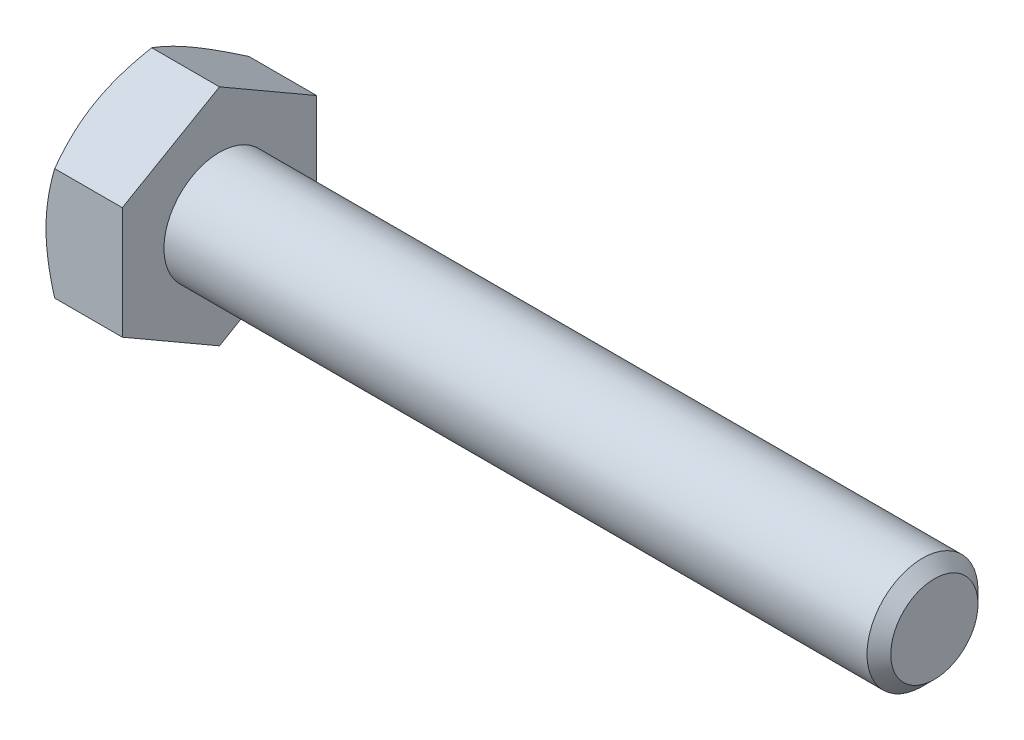
ISO-10303-21;
HEADER;
FILE_DESCRIPTION(('STEP AP214'),'2;1');
FILE_NAME('part.step','',(''),(''),'','','');
FILE_SCHEMA(('AUTOMOTIVE_DESIGN { 1 0 10303 214 1 1 1 1 }'));
ENDSEC;
DATA;
#1=APPLICATION_CONTEXT('core data for automotive mechanical design processes');
#2=APPLICATION_PROTOCOL_DEFINITION('international standard','automotive_design',2000,#1);
#3=PRODUCT_CONTEXT('',#1,'mechanical');
#4=PRODUCT('Part','Part','',(#3));
#5=PRODUCT_RELATED_PRODUCT_CATEGORY('part','',(#4));
#6=PRODUCT_DEFINITION_FORMATION('','',#4);
#7=PRODUCT_DEFINITION_CONTEXT('part definition',#1,'design');
#8=PRODUCT_DEFINITION('design','',#6,#7);
#9=PRODUCT_DEFINITION_SHAPE('','',#8);
#10=(LENGTH_UNIT() NAMED_UNIT(*) SI_UNIT(.MILLI.,.METRE.));
#11=(NAMED_UNIT(*) PLANE_ANGLE_UNIT() SI_UNIT($,.RADIAN.));
#12=(NAMED_UNIT(*) SI_UNIT($,.STERADIAN.) SOLID_ANGLE_UNIT());
#13=UNCERTAINTY_MEASURE_WITH_UNIT(LENGTH_MEASURE(1.E-05),#10,'distance_accuracy_value','');
#14=(GEOMETRIC_REPRESENTATION_CONTEXT(3) GLOBAL_UNCERTAINTY_ASSIGNED_CONTEXT((#13)) GLOBAL_UNIT_ASSIGNED_CONTEXT((#10,
#11,#12)) REPRESENTATION_CONTEXT('',''));
#15=CARTESIAN_POINT('',(0.,0.,0.));
#16=DIRECTION('',(0.,0.,1.));
#17=DIRECTION('',(1.,0.,0.));
#18=AXIS2_PLACEMENT_3D('',#15,#16,#17);
#19=CARTESIAN_POINT('',(-22.6298125,-3.20790243318485,5.55625));
#20=DIRECTION('',(0.,0.,-1.));
#21=DIRECTION('',(-1.,0.,0.));
#22=AXIS2_PLACEMENT_3D('',#19,#20,#21);
#23=PLANE('',#22);
#24=CARTESIAN_POINT('',(-19.8563750598475,-8.74399027782085,5.55625));
#25=CARTESIAN_POINT('',(-19.9751476461868,-8.50018623960062,5.55625));
#26=CARTESIAN_POINT('',(-20.0928174899284,-8.25583594381363,5.55625));
#27=CARTESIAN_POINT('',(-20.325333832282,-7.76575275757413,5.55625));
#28=CARTESIAN_POINT('',(-20.440179909394,-7.52001966736057,5.55625));
#29=CARTESIAN_POINT('',(-20.6669815667827,-7.02567502384834,5.55625));
#30=CARTESIAN_POINT('',(-20.7789190770691,-6.77705515244964,5.55625));
#31=CARTESIAN_POINT('',(-20.9983791452201,-6.27788161036476,5.55625));
#32=CARTESIAN_POINT('',(-21.1059019036307,-6.02732802813559,5.55625));
#33=CARTESIAN_POINT('',(-21.3189068972481,-5.51539046395943,5.55625));
#34=CARTESIAN_POINT('',(-21.4241977010289,-5.25392641019769,5.55625));
#35=CARTESIAN_POINT('',(-21.6271139859531,-4.72798657633179,5.55625));
#36=CARTESIAN_POINT('',(-21.7247386251359,-4.4635104690617,5.55625));
#37=CARTESIAN_POINT('',(-21.9098532159805,-3.93158168881508,5.55625));
#38=CARTESIAN_POINT('',(-21.9973626158621,-3.66413584916098,5.55625));
#39=CARTESIAN_POINT('',(-22.1595224426472,-3.12540698244495,5.55625));
#40=CARTESIAN_POINT('',(-22.2341767862806,-2.8541251515052,5.55625));
#41=CARTESIAN_POINT('',(-22.3667361579561,-2.30908269819076,5.55625));
#42=CARTESIAN_POINT('',(-22.4247346690269,-2.03534517239951,5.55625));
#43=CARTESIAN_POINT('',(-22.5207733321313,-1.48429810038529,5.55625));
#44=CARTESIAN_POINT('',(-22.5588156464521,-1.20698894449172,5.55625));
#45=CARTESIAN_POINT('',(-22.5983928025883,-0.791294730238438,5.55625));
#46=CARTESIAN_POINT('',(-22.6086589019217,-0.653708210797403,5.55625));
#47=CARTESIAN_POINT('',(-22.6233621872178,-0.378228689873297,5.55625));
#48=CARTESIAN_POINT('',(-22.6277999263492,-0.240335718720034,5.55625));
#49=CARTESIAN_POINT('',(-22.6307354775746,0.0355251294735002,5.55625));
#50=CARTESIAN_POINT('',(-22.6292327728321,0.17349301198712,5.55625));
#51=CARTESIAN_POINT('',(-22.620326510162,0.449228444418539,5.55625));
#52=CARTESIAN_POINT('',(-22.6129231815845,0.586996001914224,5.55625));
#53=CARTESIAN_POINT('',(-22.5884869357947,0.914267814879004,5.55625));
#54=CARTESIAN_POINT('',(-22.5688672240741,1.10358330996904,5.55625));
#55=CARTESIAN_POINT('',(-22.519526812407,1.48088314069775,5.55625));
#56=CARTESIAN_POINT('',(-22.4898048478651,1.66886730667232,5.55625));
#57=CARTESIAN_POINT('',(-22.3870555520625,2.23056093652213,5.55625));
#58=CARTESIAN_POINT('',(-22.3004606134045,2.60182549681906,5.55625));
#59=CARTESIAN_POINT('',(-22.1493261064939,3.15725728719583,5.55625));
#60=CARTESIAN_POINT('',(-22.0946586125065,3.3442770213325,5.55625));
#61=CARTESIAN_POINT('',(-21.9794060536328,3.71650214758287,5.55625));
#62=CARTESIAN_POINT('',(-21.9188209432783,3.90170752574391,5.55625));
#63=CARTESIAN_POINT('',(-21.792725047258,4.27035971017338,5.55625));
#64=CARTESIAN_POINT('',(-21.7272156566373,4.45380699802654,5.55625));
#65=CARTESIAN_POINT('',(-21.5920659146602,4.81916376337002,5.55625));
#66=CARTESIAN_POINT('',(-21.5224256570347,5.00107327564604,5.55625));
#67=CARTESIAN_POINT('',(-21.3300333966823,5.48965633955828,5.55625));
#68=CARTESIAN_POINT('',(-21.2040472769738,5.79505515575441,5.55625));
#69=CARTESIAN_POINT('',(-20.9446962852557,6.40271511378121,5.55625));
#70=CARTESIAN_POINT('',(-20.8113306013023,6.70497590598521,5.55625));
#71=CARTESIAN_POINT('',(-20.5389631146457,7.30707795189491,5.55625));
#72=CARTESIAN_POINT('',(-20.3999591790448,7.60691823753554,5.55625));
#73=CARTESIAN_POINT('',(-20.1176603653161,8.20455029953286,5.55625));
#74=CARTESIAN_POINT('',(-19.9743656605298,8.50234215804727,5.55625));
#75=CARTESIAN_POINT('',(-19.6841870855033,9.09675869917466,5.55625));
#76=CARTESIAN_POINT('',(-19.5372978399505,9.3933807523097,5.55625));
#77=CARTESIAN_POINT('',(-19.240841477218,9.98528417281851,5.55625));
#78=CARTESIAN_POINT('',(-19.0912743379345,10.2805655291008,5.55625));
#79=CARTESIAN_POINT('',(-18.6394394266152,11.1646418956815,5.55625));
#80=CARTESIAN_POINT('',(-18.3339730016145,11.7518013851031,5.55625));
#81=CARTESIAN_POINT('',(-17.7498679596005,12.8613257548756,5.55625));
#82=CARTESIAN_POINT('',(-17.4717985850974,13.3839917708193,5.55625));
#83=CARTESIAN_POINT('',(-16.912301428865,14.42756352459,5.55625));
#84=CARTESIAN_POINT('',(-16.6308734420221,14.9484691523898,5.55625));
#85=CARTESIAN_POINT('',(-16.0664769946515,15.9871872994245,5.55625));
#86=CARTESIAN_POINT('',(-15.7835168360065,16.5050043366708,5.55625));
#87=CARTESIAN_POINT('',(-15.2156898665637,17.5395393792358,5.55625));
#88=CARTESIAN_POINT('',(-14.9308232075218,18.056257467815,5.55625));
#89=CARTESIAN_POINT('',(-14.6452623528106,18.5725892171576,5.55625));
#90=B_SPLINE_CURVE_WITH_KNOTS('',3,(#24,#25,#26,#27,#28,#29,#30,#31,#32,#33,#34,#35,#36,#37,#38,
#39,#40,#41,#42,#43,#44,#45,#46,#47,#48,#49,#50,#51,#52,#53,#54,#55,#56,#57,#58,#59,#60,#61,#62,
#63,#64,#65,#66,#67,#68,#69,#70,#71,#72,#73,#74,#75,#76,#77,#78,#79,#80,#81,#82,#83,#84,#85,#86,
#87,#88,#89),.UNSPECIFIED.,.F.,.F.,(4,2,2,2,2,2,2,2,2,2,2,2,2,2,2,2,2,2,2,2,2,2,2,2,2,2,2,2,2,2,
2,2,4),(0.,0.813597715870461,1.62731614804298,2.4452527565403,3.26315216797367,4.10866347940256,
4.95426752225437,5.79821771301645,6.64191030891903,7.48077063935046,8.31954005908318,
8.73334237828506,9.1471054207352,9.56090446260157,9.97468742138602,10.5453561295019,
11.1160962999972,12.2581342200709,12.8426194652768,13.4271092017353,14.0114339722529,
14.5957454893196,15.5866951889479,16.5777541364282,17.5691915541017,18.560588972886,
19.5535724635683,20.5465641542476,22.5321054768716,24.308190208571,26.0843839680985,
27.8546363109357,29.624749380466),.UNSPECIFIED.);
#91=CARTESIAN_POINT('',(-22.1335482665182,-3.20790243318485,5.55625));
#92=VERTEX_POINT('',#91);
#93=CARTESIAN_POINT('',(-22.6298125,0.,5.55625));
#94=VERTEX_POINT('',#93);
#95=EDGE_CURVE('E284',#92,#94,#90,.T.);
#96=ORIENTED_EDGE('',*,*,#95,.F.);
#97=DIRECTION('',(1.,0.,0.));
#98=VECTOR('',#97,1.);
#99=CARTESIAN_POINT('',(-22.6298125,-3.20790243318485,5.55625));
#100=LINE('',#99,#98);
#101=CARTESIAN_POINT('',(-18.2641875,-3.20790243318485,5.55625));
#102=VERTEX_POINT('',#101);
#103=EDGE_CURVE('E287',#92,#102,#100,.T.);
#104=ORIENTED_EDGE('',*,*,#103,.T.);
#105=DIRECTION('',(0.,1.,0.));
#106=VECTOR('',#105,1.);
#107=CARTESIAN_POINT('',(-18.2641875,-3.20790243318485,5.55625));
#108=LINE('',#107,#106);
#109=CARTESIAN_POINT('',(-18.2641875,3.20790243318486,5.55625));
#110=VERTEX_POINT('',#109);
#111=EDGE_CURVE('E290',#102,#110,#108,.T.);
#112=ORIENTED_EDGE('',*,*,#111,.T.);
#113=DIRECTION('',(1.,0.,0.));
#114=VECTOR('',#113,1.);
#115=CARTESIAN_POINT('',(-22.6298125,3.20790243318486,5.55625));
#116=LINE('',#115,#114);
#117=CARTESIAN_POINT('',(-22.1335482665182,3.20790243318486,5.55625));
#118=VERTEX_POINT('',#117);
#119=EDGE_CURVE('E246',#118,#110,#116,.T.);
#120=ORIENTED_EDGE('',*,*,#119,.F.);
#121=EDGE_CURVE('E123',#94,#118,#90,.T.);
#122=ORIENTED_EDGE('',*,*,#121,.F.);
#123=EDGE_LOOP('',(#96,#104,#112,#120,#122));
#124=FACE_BOUND('',#123,.T.);
#125=ADVANCED_FACE('F46',(#124),#23,.F.);
#126=CARTESIAN_POINT('',(-22.6298125,3.20790243318486,5.55625));
#127=DIRECTION('',(0.,-0.866025403784438,-0.5));
#128=DIRECTION('',(0.,0.5,-0.866025403784439));
#129=AXIS2_PLACEMENT_3D('',#126,#127,#128);
#130=PLANE('',#129);
#131=CARTESIAN_POINT('',(-22.1334815980518,3.20778696313102,5.55645));
#132=CARTESIAN_POINT('',(-22.1741869396287,3.27830048099898,5.43431700443227));
#133=CARTESIAN_POINT('',(-22.2130449606368,3.34907690760433,5.31172863757365));
#134=CARTESIAN_POINT('',(-22.2865575665754,3.49120454378004,5.06555635055765));
#135=CARTESIAN_POINT('',(-22.3212103381981,3.56255598725623,4.94197202526351));
#136=CARTESIAN_POINT('',(-22.4181806144389,3.7777527611819,4.56924027919934));
#137=CARTESIAN_POINT('',(-22.473336445498,3.92244755263586,4.3186215488105));
#138=CARTESIAN_POINT('',(-22.538013595153,4.13898067940738,3.94357517172046));
#139=CARTESIAN_POINT('',(-22.5564383296374,4.21017202280888,3.82026814788998));
#140=CARTESIAN_POINT('',(-22.5873341337596,4.35287639627881,3.57309692257779));
#141=CARTESIAN_POINT('',(-22.599805729438,4.42438939736052,3.44923277130254));
#142=CARTESIAN_POINT('',(-22.6184774134017,4.56753961185542,3.20128932668299));
#143=CARTESIAN_POINT('',(-22.6246846193166,4.63917659144933,3.07721043832556));
#144=CARTESIAN_POINT('',(-22.6307010825862,4.7825127822332,2.82894487332451));
#145=CARTESIAN_POINT('',(-22.6305105375727,4.85421199143242,2.70475820012895));
#146=CARTESIAN_POINT('',(-22.6211942573071,5.05064720059278,2.36452243746779));
#147=CARTESIAN_POINT('',(-22.6055528403106,5.1753189069971,2.14858470770919));
#148=CARTESIAN_POINT('',(-22.5559525950254,5.42383425573453,1.71814349723526));
#149=CARTESIAN_POINT('',(-22.5219768117333,5.54767702400135,1.50364153044716));
#150=CARTESIAN_POINT('',(-22.4370467499519,5.79669255822861,1.07233397329164));
#151=CARTESIAN_POINT('',(-22.3857326119579,5.92183390122649,0.8555828090919));
#152=CARTESIAN_POINT('',(-22.2692700447076,6.17025031750736,0.42531295465925));
#153=CARTESIAN_POINT('',(-22.2041489741206,6.29352857247572,0.211788753585623));
#154=CARTESIAN_POINT('',(-22.1334815980518,6.41592033642355,-0.000199999999997832));
#155=B_SPLINE_CURVE_WITH_KNOTS('',3,(#131,#132,#133,#134,#135,#136,#137,#138,#139,#140,#141,
#142,#143,#144,#145,#146,#147,#148,#149,#150,#151,#152,#153,#154),.UNSPECIFIED.,.F.,.F.,(4,2,2,
2,2,2,2,2,2,2,2,4),(0.,0.440316908268042,0.880823012040824,1.76366572331169,2.19427472390783,
2.62484566732156,3.05492684132792,3.4849947297767,4.23370964386675,4.98311813377593,
5.74914806559356,6.51367405016873),.UNSPECIFIED.);
#156=CARTESIAN_POINT('',(-22.6298125,4.81185364977729,2.778125));
#157=VERTEX_POINT('',#156);
#158=EDGE_CURVE('E119',#118,#157,#155,.T.);
#159=ORIENTED_EDGE('',*,*,#158,.F.);
#160=ORIENTED_EDGE('',*,*,#119,.T.);
#161=DIRECTION('',(0.,0.5,-0.866025403784438));
#162=VECTOR('',#161,1.);
#163=CARTESIAN_POINT('',(-18.2641875,3.20790243318486,5.55625));
#164=LINE('',#163,#162);
#165=CARTESIAN_POINT('',(-18.2641875,6.41580486636972,0.));
#166=VERTEX_POINT('',#165);
#167=EDGE_CURVE('E314',#110,#166,#164,.T.);
#168=ORIENTED_EDGE('',*,*,#167,.T.);
#169=DIRECTION('',(1.,0.,0.));
#170=VECTOR('',#169,1.);
#171=CARTESIAN_POINT('',(-22.6298125,6.41580486636972,0.));
#172=LINE('',#171,#170);
#173=CARTESIAN_POINT('',(-22.1335482665182,6.41580486636972,0.));
#174=VERTEX_POINT('',#173);
#175=EDGE_CURVE('E144',#174,#166,#172,.T.);
#176=ORIENTED_EDGE('',*,*,#175,.F.);
#177=EDGE_CURVE('E128',#157,#174,#155,.T.);
#178=ORIENTED_EDGE('',*,*,#177,.F.);
#179=EDGE_LOOP('',(#159,#160,#168,#176,#178));
#180=FACE_BOUND('',#179,.T.);
#181=ADVANCED_FACE('F142',(#180),#130,.F.);
#182=CARTESIAN_POINT('',(-22.6298125,6.41580486636972,0.));
#183=DIRECTION('',(0.,-0.866025403784439,0.5));
#184=DIRECTION('',(0.,-0.5,-0.866025403784439));
#185=AXIS2_PLACEMENT_3D('',#182,#183,#184);
#186=PLANE('',#185);
#187=CARTESIAN_POINT('',(-22.1334815980518,6.41592033642355,0.000200000000001893));
#188=CARTESIAN_POINT('',(-22.1741869396287,6.34540681855559,-0.121932995567729));
#189=CARTESIAN_POINT('',(-22.2130449606368,6.27463039195025,-0.244521362426351));
#190=CARTESIAN_POINT('',(-22.2865575665754,6.13250275577453,-0.490693649442355));
#191=CARTESIAN_POINT('',(-22.3212103381981,6.06115131229835,-0.614277974736486));
#192=CARTESIAN_POINT('',(-22.4181806144389,5.84595453837268,-0.987009720800661));
#193=CARTESIAN_POINT('',(-22.473336445498,5.70125974691872,-1.2376284511895));
#194=CARTESIAN_POINT('',(-22.538013595153,5.48472662014719,-1.61267482827954));
#195=CARTESIAN_POINT('',(-22.5564383296374,5.41353527674569,-1.73598185211002));
#196=CARTESIAN_POINT('',(-22.5873341337596,5.27083090327577,-1.98315307742221));
#197=CARTESIAN_POINT('',(-22.599805729438,5.19931790219406,-2.10701722869746));
#198=CARTESIAN_POINT('',(-22.6184774134017,5.05616768769916,-2.35496067331701));
#199=CARTESIAN_POINT('',(-22.6246846193166,4.98453070810525,-2.47903956167444));
#200=CARTESIAN_POINT('',(-22.6307010825862,4.84119451732138,-2.72730512667549));
#201=CARTESIAN_POINT('',(-22.6305105375727,4.76949530812216,-2.85149179987105));
#202=CARTESIAN_POINT('',(-22.6211942573071,4.5730600989618,-3.1917275625322));
#203=CARTESIAN_POINT('',(-22.6055528403106,4.44838839255747,-3.40766529229081));
#204=CARTESIAN_POINT('',(-22.5559525950254,4.19987304382004,-3.83810650276474));
#205=CARTESIAN_POINT('',(-22.5219768117333,4.07603027555323,-4.05260846955284));
#206=CARTESIAN_POINT('',(-22.4370467499519,3.82701474132597,-4.48391602670836));
#207=CARTESIAN_POINT('',(-22.3857326119579,3.70187339832809,-4.7006671909081));
#208=CARTESIAN_POINT('',(-22.2692700447076,3.45345698204721,-5.13093704534075));
#209=CARTESIAN_POINT('',(-22.2041489741206,3.33017872707885,-5.34446124641438));
#210=CARTESIAN_POINT('',(-22.1334815980518,3.20778696313102,-5.55645));
#211=B_SPLINE_CURVE_WITH_KNOTS('',3,(#187,#188,#189,#190,#191,#192,#193,#194,#195,#196,#197,
#198,#199,#200,#201,#202,#203,#204,#205,#206,#207,#208,#209,#210),.UNSPECIFIED.,.F.,.F.,(4,2,2,
2,2,2,2,2,2,2,2,4),(0.,0.440316908268041,0.880823012040823,1.76366572331169,2.19427472390783,
2.62484566732156,3.05492684132792,3.48499472977669,4.23370964386674,4.98311813377593,
5.74914806559356,6.51367405016872),.UNSPECIFIED.);
#212=CARTESIAN_POINT('',(-22.6298125,4.81185364977729,-2.778125));
#213=VERTEX_POINT('',#212);
#214=EDGE_CURVE('E133',#174,#213,#211,.T.);
#215=ORIENTED_EDGE('',*,*,#214,.F.);
#216=ORIENTED_EDGE('',*,*,#175,.T.);
#217=DIRECTION('',(0.,-0.5,-0.866025403784439));
#218=VECTOR('',#217,1.);
#219=CARTESIAN_POINT('',(-18.2641875,6.41580486636972,0.));
#220=LINE('',#219,#218);
#221=CARTESIAN_POINT('',(-18.2641875,3.20790243318486,-5.55625));
#222=VERTEX_POINT('',#221);
#223=EDGE_CURVE('E311',#166,#222,#220,.T.);
#224=ORIENTED_EDGE('',*,*,#223,.T.);
#225=DIRECTION('',(1.,0.,0.));
#226=VECTOR('',#225,1.);
#227=CARTESIAN_POINT('',(-22.6298125,3.20790243318486,-5.55625));
#228=LINE('',#227,#226);
#229=CARTESIAN_POINT('',(-22.1335482665182,3.20790243318486,-5.55625));
#230=VERTEX_POINT('',#229);
#231=EDGE_CURVE('E306',#230,#222,#228,.T.);
#232=ORIENTED_EDGE('',*,*,#231,.F.);
#233=EDGE_CURVE('E147',#213,#230,#211,.T.);
#234=ORIENTED_EDGE('',*,*,#233,.F.);
#235=EDGE_LOOP('',(#215,#216,#224,#232,#234));
#236=FACE_BOUND('',#235,.T.);
#237=ADVANCED_FACE('F208',(#236),#186,.F.);
#238=CARTESIAN_POINT('',(-22.6298125,3.20790243318486,-5.55625));
#239=DIRECTION('',(0.,0.,1.));
#240=DIRECTION('',(1.,0.,0.));
#241=AXIS2_PLACEMENT_3D('',#238,#239,#240);
#242=PLANE('',#241);
#243=CARTESIAN_POINT('',(-19.8563750598475,-8.74399027782085,-5.55625));
#244=CARTESIAN_POINT('',(-19.9751476461868,-8.50018623960062,-5.55625));
#245=CARTESIAN_POINT('',(-20.0928174899284,-8.25583594381362,-5.55625));
#246=CARTESIAN_POINT('',(-20.325333832282,-7.76575275757412,-5.55625));
#247=CARTESIAN_POINT('',(-20.440179909394,-7.52001966736057,-5.55625));
#248=CARTESIAN_POINT('',(-20.6669815667827,-7.02567502384834,-5.55625));
#249=CARTESIAN_POINT('',(-20.7789190770691,-6.77705515244963,-5.55625));
#250=CARTESIAN_POINT('',(-20.9983791452201,-6.27788161036475,-5.55625));
#251=CARTESIAN_POINT('',(-21.1059019036307,-6.02732802813559,-5.55625));
#252=CARTESIAN_POINT('',(-21.3189068972481,-5.51539046395943,-5.55625));
#253=CARTESIAN_POINT('',(-21.424197701029,-5.25392641019769,-5.55625));
#254=CARTESIAN_POINT('',(-21.6271139859531,-4.72798657633179,-5.55625));
#255=CARTESIAN_POINT('',(-21.7247386251359,-4.46351046906169,-5.55625));
#256=CARTESIAN_POINT('',(-21.9098532159805,-3.93158168881508,-5.55625));
#257=CARTESIAN_POINT('',(-21.9973626158621,-3.66413584916098,-5.55625));
#258=CARTESIAN_POINT('',(-22.1595224426472,-3.12540698244495,-5.55625));
#259=CARTESIAN_POINT('',(-22.2341767862806,-2.8541251515052,-5.55625));
#260=CARTESIAN_POINT('',(-22.3667361579561,-2.30908269819076,-5.55625));
#261=CARTESIAN_POINT('',(-22.4247346690269,-2.03534517239951,-5.55625));
#262=CARTESIAN_POINT('',(-22.5207733321313,-1.4842981003853,-5.55625));
#263=CARTESIAN_POINT('',(-22.5588156464521,-1.20698894449172,-5.55625));
#264=CARTESIAN_POINT('',(-22.5983928025883,-0.791294730238441,-5.55625));
#265=CARTESIAN_POINT('',(-22.6086589019217,-0.653708210797406,-5.55625));
#266=CARTESIAN_POINT('',(-22.6233621872178,-0.378228689873302,-5.55625));
#267=CARTESIAN_POINT('',(-22.6277999263492,-0.240335718720038,-5.55625));
#268=CARTESIAN_POINT('',(-22.6307354775746,0.035525129473495,-5.55625));
#269=CARTESIAN_POINT('',(-22.6292327728321,0.173493011987115,-5.55625));
#270=CARTESIAN_POINT('',(-22.620326510162,0.449228444418533,-5.55625));
#271=CARTESIAN_POINT('',(-22.6129231815845,0.586996001914218,-5.55625));
#272=CARTESIAN_POINT('',(-22.5884869357947,0.914267814878999,-5.55625));
#273=CARTESIAN_POINT('',(-22.5688672240741,1.10358330996903,-5.55625));
#274=CARTESIAN_POINT('',(-22.519526812407,1.48088314069774,-5.55625));
#275=CARTESIAN_POINT('',(-22.4898048478651,1.66886730667231,-5.55625));
#276=CARTESIAN_POINT('',(-22.3870555520625,2.23056093652212,-5.55625));
#277=CARTESIAN_POINT('',(-22.3004606134045,2.60182549681905,-5.55625));
#278=CARTESIAN_POINT('',(-22.1493261064939,3.15725728719582,-5.55625));
#279=CARTESIAN_POINT('',(-22.0946586125065,3.34427702133249,-5.55625));
#280=CARTESIAN_POINT('',(-21.9794060536328,3.71650214758286,-5.55625));
#281=CARTESIAN_POINT('',(-21.9188209432783,3.9017075257439,-5.55625));
#282=CARTESIAN_POINT('',(-21.7927250472581,4.27035971017337,-5.55625));
#283=CARTESIAN_POINT('',(-21.7272156566373,4.45380699802653,-5.55625));
#284=CARTESIAN_POINT('',(-21.5920659146602,4.81916376337001,-5.55625));
#285=CARTESIAN_POINT('',(-21.5224256570347,5.00107327564603,-5.55625));
#286=CARTESIAN_POINT('',(-21.3300333966823,5.48965633955827,-5.55625));
#287=CARTESIAN_POINT('',(-21.2040472769738,5.7950551557544,-5.55625));
#288=CARTESIAN_POINT('',(-20.9446962852557,6.40271511378119,-5.55625));
#289=CARTESIAN_POINT('',(-20.8113306013023,6.7049759059852,-5.55625));
#290=CARTESIAN_POINT('',(-20.5389631146457,7.3070779518949,-5.55625));
#291=CARTESIAN_POINT('',(-20.3999591790448,7.60691823753553,-5.55625));
#292=CARTESIAN_POINT('',(-20.1176603653161,8.20455029953285,-5.55625));
#293=CARTESIAN_POINT('',(-19.9743656605298,8.50234215804726,-5.55625));
#294=CARTESIAN_POINT('',(-19.6841870855033,9.09675869917465,-5.55625));
#295=CARTESIAN_POINT('',(-19.5372978399505,9.39338075230969,-5.55625));
#296=CARTESIAN_POINT('',(-19.240841477218,9.9852841728185,-5.55625));
#297=CARTESIAN_POINT('',(-19.0912743379345,10.2805655291007,-5.55625));
#298=CARTESIAN_POINT('',(-18.6394394266152,11.1646418956815,-5.55625));
#299=CARTESIAN_POINT('',(-18.3339730016145,11.7518013851031,-5.55625));
#300=CARTESIAN_POINT('',(-17.7498679596005,12.8613257548756,-5.55625));
#301=CARTESIAN_POINT('',(-17.4717985850975,13.3839917708193,-5.55625));
#302=CARTESIAN_POINT('',(-16.912301428865,14.42756352459,-5.55625));
#303=CARTESIAN_POINT('',(-16.6308734420222,14.9484691523898,-5.55625));
#304=CARTESIAN_POINT('',(-16.0664769946515,15.9871872994245,-5.55625));
#305=CARTESIAN_POINT('',(-15.7835168360065,16.5050043366708,-5.55625));
#306=CARTESIAN_POINT('',(-15.2156898665637,17.5395393792358,-5.55625));
#307=CARTESIAN_POINT('',(-14.9308232075218,18.056257467815,-5.55625));
#308=CARTESIAN_POINT('',(-14.6452623528106,18.5725892171576,-5.55625));
#309=B_SPLINE_CURVE_WITH_KNOTS('',3,(#243,#244,#245,#246,#247,#248,#249,#250,#251,#252,#253,
#254,#255,#256,#257,#258,#259,#260,#261,#262,#263,#264,#265,#266,#267,#268,#269,#270,#271,#272,
#273,#274,#275,#276,#277,#278,#279,#280,#281,#282,#283,#284,#285,#286,#287,#288,#289,#290,#291,
#292,#293,#294,#295,#296,#297,#298,#299,#300,#301,#302,#303,#304,#305,#306,#307,#308),
.UNSPECIFIED.,.F.,.F.,(4,2,2,2,2,2,2,2,2,2,2,2,2,2,2,2,2,2,2,2,2,2,2,2,2,2,2,2,2,2,2,2,4),(0.,
0.813597715870461,1.62731614804298,2.4452527565403,3.26315216797367,4.10866347940255,
4.95426752225437,5.79821771301645,6.64191030891902,7.48077063935046,8.31954005908317,
8.73334237828505,9.14710542073519,9.56090446260156,9.97468742138601,10.5453561295019,
11.1160962999972,12.2581342200709,12.8426194652768,13.4271092017353,14.0114339722529,
14.5957454893196,15.5866951889479,16.5777541364282,17.5691915541016,18.5605889728859,
19.5535724635683,20.5465641542476,22.5321054768716,24.308190208571,26.0843839680985,
27.8546363109357,29.624749380466),.UNSPECIFIED.);
#310=CARTESIAN_POINT('',(-22.6298125,0.,-5.55625));
#311=VERTEX_POINT('',#310);
#312=EDGE_CURVE('E202',#230,#311,#309,.F.);
#313=ORIENTED_EDGE('',*,*,#312,.F.);
#314=ORIENTED_EDGE('',*,*,#231,.T.);
#315=DIRECTION('',(0.,-1.,0.));
#316=VECTOR('',#315,1.);
#317=CARTESIAN_POINT('',(-18.2641875,3.20790243318486,-5.55625));
#318=LINE('',#317,#316);
#319=CARTESIAN_POINT('',(-18.2641875,-3.20790243318486,-5.55625));
#320=VERTEX_POINT('',#319);
#321=EDGE_CURVE('E319',#222,#320,#318,.T.);
#322=ORIENTED_EDGE('',*,*,#321,.T.);
#323=DIRECTION('',(1.,0.,0.));
#324=VECTOR('',#323,1.);
#325=CARTESIAN_POINT('',(-22.6298125,-3.20790243318486,-5.55625));
#326=LINE('',#325,#324);
#327=CARTESIAN_POINT('',(-22.1335482665182,-3.20790243318486,-5.55625));
#328=VERTEX_POINT('',#327);
#329=EDGE_CURVE('E268',#328,#320,#326,.T.);
#330=ORIENTED_EDGE('',*,*,#329,.F.);
#331=EDGE_CURVE('E195',#311,#328,#309,.F.);
#332=ORIENTED_EDGE('',*,*,#331,.F.);
#333=EDGE_LOOP('',(#313,#314,#322,#330,#332));
#334=FACE_BOUND('',#333,.T.);
#335=ADVANCED_FACE('F204',(#334),#242,.F.);
#336=CARTESIAN_POINT('',(-22.6298125,-3.20790243318486,-5.55625));
#337=DIRECTION('',(0.,0.866025403784439,0.5));
#338=DIRECTION('',(0.,-0.5,0.866025403784439));
#339=AXIS2_PLACEMENT_3D('',#336,#337,#338);
#340=PLANE('',#339);
#341=CARTESIAN_POINT('',(-22.1334815980518,-3.20778696313102,-5.55645));
#342=CARTESIAN_POINT('',(-22.1741869396287,-3.27830048099898,-5.43431700443227));
#343=CARTESIAN_POINT('',(-22.2130449606368,-3.34907690760433,-5.31172863757364));
#344=CARTESIAN_POINT('',(-22.2865575665754,-3.49120454378004,-5.06555635055764));
#345=CARTESIAN_POINT('',(-22.3212103381981,-3.56255598725623,-4.94197202526351));
#346=CARTESIAN_POINT('',(-22.4181806144389,-3.7777527611819,-4.56924027919934));
#347=CARTESIAN_POINT('',(-22.473336445498,-3.92244755263586,-4.3186215488105));
#348=CARTESIAN_POINT('',(-22.538013595153,-4.13898067940738,-3.94357517172046));
#349=CARTESIAN_POINT('',(-22.5564383296374,-4.21017202280888,-3.82026814788997));
#350=CARTESIAN_POINT('',(-22.5873341337596,-4.35287639627881,-3.57309692257778));
#351=CARTESIAN_POINT('',(-22.599805729438,-4.42438939736052,-3.44923277130254));
#352=CARTESIAN_POINT('',(-22.6184774134017,-4.56753961185542,-3.20128932668298));
#353=CARTESIAN_POINT('',(-22.6246846193166,-4.63917659144933,-3.07721043832556));
#354=CARTESIAN_POINT('',(-22.6307010825862,-4.7825127822332,-2.82894487332451));
#355=CARTESIAN_POINT('',(-22.6305105375727,-4.85421199143242,-2.70475820012895));
#356=CARTESIAN_POINT('',(-22.6211942573071,-5.05064720059277,-2.36452243746779));
#357=CARTESIAN_POINT('',(-22.6055528403106,-5.1753189069971,-2.14858470770919));
#358=CARTESIAN_POINT('',(-22.5559525950254,-5.42383425573453,-1.71814349723526));
#359=CARTESIAN_POINT('',(-22.5219768117333,-5.54767702400135,-1.50364153044716));
#360=CARTESIAN_POINT('',(-22.4370467499519,-5.7966925582286,-1.07233397329164));
#361=CARTESIAN_POINT('',(-22.3857326119579,-5.92183390122649,-0.855582809091897));
#362=CARTESIAN_POINT('',(-22.2692700447076,-6.17025031750736,-0.425312954659246));
#363=CARTESIAN_POINT('',(-22.2041489741206,-6.29352857247572,-0.21178875358562));
#364=CARTESIAN_POINT('',(-22.1334815980518,-6.41592033642355,0.000199999999999564));
#365=B_SPLINE_CURVE_WITH_KNOTS('',3,(#341,#342,#343,#344,#345,#346,#347,#348,#349,#350,#351,
#352,#353,#354,#355,#356,#357,#358,#359,#360,#361,#362,#363,#364),.UNSPECIFIED.,.F.,.F.,(4,2,2,
2,2,2,2,2,2,2,2,4),(0.,0.440316908268042,0.880823012040822,1.76366572331169,2.19427472390783,
2.62484566732156,3.05492684132792,3.48499472977669,4.23370964386674,4.98311813377593,
5.74914806559356,6.51367405016872),.UNSPECIFIED.);
#366=CARTESIAN_POINT('',(-22.6298125,-4.81185364977729,-2.778125));
#367=VERTEX_POINT('',#366);
#368=EDGE_CURVE('E203',#328,#367,#365,.T.);
#369=ORIENTED_EDGE('',*,*,#368,.F.);
#370=ORIENTED_EDGE('',*,*,#329,.T.);
#371=DIRECTION('',(0.,-0.5,0.866025403784439));
#372=VECTOR('',#371,1.);
#373=CARTESIAN_POINT('',(-18.2641875,-3.20790243318486,-5.55625));
#374=LINE('',#373,#372);
#375=CARTESIAN_POINT('',(-18.2641875,-6.41580486636971,0.));
#376=VERTEX_POINT('',#375);
#377=EDGE_CURVE('E300',#320,#376,#374,.T.);
#378=ORIENTED_EDGE('',*,*,#377,.T.);
#379=DIRECTION('',(1.,0.,0.));
#380=VECTOR('',#379,1.);
#381=CARTESIAN_POINT('',(-22.6298125,-6.41580486636971,0.));
#382=LINE('',#381,#380);
#383=CARTESIAN_POINT('',(-22.1335482665182,-6.41580486636971,0.));
#384=VERTEX_POINT('',#383);
#385=EDGE_CURVE('E295',#384,#376,#382,.T.);
#386=ORIENTED_EDGE('',*,*,#385,.F.);
#387=EDGE_CURVE('E189',#367,#384,#365,.T.);
#388=ORIENTED_EDGE('',*,*,#387,.F.);
#389=EDGE_LOOP('',(#369,#370,#378,#386,#388));
#390=FACE_BOUND('',#389,.T.);
#391=ADVANCED_FACE('F207',(#390),#340,.F.);
#392=CARTESIAN_POINT('',(-22.6298125,-6.41580486636971,0.));
#393=DIRECTION('',(0.,0.866025403784439,-0.5));
#394=DIRECTION('',(0.,0.5,0.866025403784439));
#395=AXIS2_PLACEMENT_3D('',#392,#393,#394);
#396=PLANE('',#395);
#397=CARTESIAN_POINT('',(-22.1334815980518,-6.41592033642355,-0.000200000000000231));
#398=CARTESIAN_POINT('',(-22.1741869396287,-6.34540681855559,0.121932995567731));
#399=CARTESIAN_POINT('',(-22.2130449606368,-6.27463039195024,0.244521362426353));
#400=CARTESIAN_POINT('',(-22.2865575665754,-6.13250275577453,0.490693649442356));
#401=CARTESIAN_POINT('',(-22.3212103381981,-6.06115131229834,0.614277974736487));
#402=CARTESIAN_POINT('',(-22.4181806144389,-5.84595453837267,0.987009720800662));
#403=CARTESIAN_POINT('',(-22.473336445498,-5.70125974691872,1.2376284511895));
#404=CARTESIAN_POINT('',(-22.538013595153,-5.48472662014719,1.61267482827954));
#405=CARTESIAN_POINT('',(-22.5564383296374,-5.41353527674569,1.73598185211002));
#406=CARTESIAN_POINT('',(-22.5873341337596,-5.27083090327576,1.98315307742221));
#407=CARTESIAN_POINT('',(-22.599805729438,-5.19931790219406,2.10701722869746));
#408=CARTESIAN_POINT('',(-22.6184774134017,-5.05616768769915,2.35496067331701));
#409=CARTESIAN_POINT('',(-22.6246846193166,-4.98453070810525,2.47903956167444));
#410=CARTESIAN_POINT('',(-22.6307010825862,-4.84119451732137,2.72730512667549));
#411=CARTESIAN_POINT('',(-22.6305105375727,-4.76949530812215,2.85149179987105));
#412=CARTESIAN_POINT('',(-22.6211942573071,-4.5730600989618,3.1917275625322));
#413=CARTESIAN_POINT('',(-22.6055528403106,-4.44838839255747,3.40766529229081));
#414=CARTESIAN_POINT('',(-22.5559525950254,-4.19987304382004,3.83810650276474));
#415=CARTESIAN_POINT('',(-22.5219768117333,-4.07603027555323,4.05260846955284));
#416=CARTESIAN_POINT('',(-22.4370467499519,-3.82701474132597,4.48391602670836));
#417=CARTESIAN_POINT('',(-22.3857326119579,-3.70187339832808,4.7006671909081));
#418=CARTESIAN_POINT('',(-22.2692700447076,-3.45345698204721,5.13093704534075));
#419=CARTESIAN_POINT('',(-22.2041489741206,-3.33017872707885,5.34446124641438));
#420=CARTESIAN_POINT('',(-22.1334815980518,-3.20778696313102,5.55645));
#421=B_SPLINE_CURVE_WITH_KNOTS('',3,(#397,#398,#399,#400,#401,#402,#403,#404,#405,#406,#407,
#408,#409,#410,#411,#412,#413,#414,#415,#416,#417,#418,#419,#420),.UNSPECIFIED.,.F.,.F.,(4,2,2,
2,2,2,2,2,2,2,2,4),(0.,0.440316908268042,0.880823012040824,1.76366572331169,2.19427472390783,
2.62484566732156,3.05492684132792,3.48499472977669,4.23370964386674,4.98311813377593,
5.74914806559356,6.51367405016873),.UNSPECIFIED.);
#422=CARTESIAN_POINT('',(-22.6298125,-4.81185364977729,2.778125));
#423=VERTEX_POINT('',#422);
#424=EDGE_CURVE('E277',#384,#423,#421,.T.);
#425=ORIENTED_EDGE('',*,*,#424,.F.);
#426=ORIENTED_EDGE('',*,*,#385,.T.);
#427=DIRECTION('',(0.,0.5,0.866025403784439));
#428=VECTOR('',#427,1.);
#429=CARTESIAN_POINT('',(-18.2641875,-6.41580486636971,0.));
#430=LINE('',#429,#428);
#431=EDGE_CURVE('E292',#376,#102,#430,.T.);
#432=ORIENTED_EDGE('',*,*,#431,.T.);
#433=ORIENTED_EDGE('',*,*,#103,.F.);
#434=EDGE_CURVE('E139',#423,#92,#421,.T.);
#435=ORIENTED_EDGE('',*,*,#434,.F.);
#436=EDGE_LOOP('',(#425,#426,#432,#433,#435));
#437=FACE_BOUND('',#436,.T.);
#438=ADVANCED_FACE('F230',(#437),#396,.F.);
#439=CARTESIAN_POINT('',(-18.2641875,0.,0.));
#440=DIRECTION('',(1.,0.,0.));
#441=DIRECTION('',(0.,0.,-1.));
#442=AXIS2_PLACEMENT_3D('',#439,#440,#441);
#443=CYLINDRICAL_SURFACE('',#442,3.175);
#444=CARTESIAN_POINT('',(21.9494553571483,0.,0.));
#445=DIRECTION('',(1.,0.,0.));
#446=DIRECTION('',(0.,0.,-1.));
#447=AXIS2_PLACEMENT_3D('',#444,#445,#446);
#448=CIRCLE('',#447,3.175);
#449=CARTESIAN_POINT('',(21.9494553571483,0.,-3.175));
#450=VERTEX_POINT('',#449);
#451=EDGE_CURVE('E239',#450,#450,#448,.F.);
#452=ORIENTED_EDGE('',*,*,#451,.T.);
#453=EDGE_LOOP('',(#452));
#454=FACE_BOUND('',#453,.T.);
#455=CARTESIAN_POINT('',(-18.2641875,0.,0.));
#456=DIRECTION('',(-1.,0.,0.));
#457=DIRECTION('',(0.,0.,1.));
#458=AXIS2_PLACEMENT_3D('',#455,#456,#457);
#459=CIRCLE('',#458,3.175);
#460=CARTESIAN_POINT('',(-18.2641875,0.,3.175));
#461=VERTEX_POINT('',#460);
#462=EDGE_CURVE('E242',#461,#461,#459,.F.);
#463=ORIENTED_EDGE('',*,*,#462,.T.);
#464=EDGE_LOOP('',(#463));
#465=FACE_BOUND('',#464,.T.);
#466=ADVANCED_FACE('F227',(#454,#465),#443,.T.);
#467=CARTESIAN_POINT('',(22.6298125,0.,0.));
#468=DIRECTION('',(1.,0.,0.));
#469=DIRECTION('',(0.,0.,-1.));
#470=AXIS2_PLACEMENT_3D('',#467,#468,#469);
#471=PLANE('',#470);
#472=CARTESIAN_POINT('',(22.6298125,0.,0.));
#473=DIRECTION('',(1.,0.,0.));
#474=DIRECTION('',(0.,0.,-1.));
#475=AXIS2_PLACEMENT_3D('',#472,#473,#474);
#476=CIRCLE('',#475,2.4946428571483);
#477=CARTESIAN_POINT('',(22.6298125,0.,-2.4946428571483));
#478=VERTEX_POINT('',#477);
#479=EDGE_CURVE('E245',#478,#478,#476,.T.);
#480=ORIENTED_EDGE('',*,*,#479,.T.);
#481=EDGE_LOOP('',(#480));
#482=FACE_BOUND('',#481,.T.);
#483=ADVANCED_FACE('F225',(#482),#471,.T.);
#484=CARTESIAN_POINT('',(22.6298125,0.,0.));
#485=DIRECTION('',(-1.,0.,0.));
#486=DIRECTION('',(0.,0.,1.));
#487=AXIS2_PLACEMENT_3D('',#484,#485,#486);
#488=CONICAL_SURFACE('',#487,2.4946428571483,0.785398163397453);
#489=ORIENTED_EDGE('',*,*,#451,.F.);
#490=EDGE_LOOP('',(#489));
#491=FACE_BOUND('',#490,.T.);
#492=ORIENTED_EDGE('',*,*,#479,.F.);
#493=EDGE_LOOP('',(#492));
#494=FACE_BOUND('',#493,.T.);
#495=ADVANCED_FACE('F48',(#491,#494),#488,.T.);
#496=CARTESIAN_POINT('',(-18.2641875,3.20790243318486,5.55625));
#497=DIRECTION('',(-1.,0.,0.));
#498=DIRECTION('',(0.,0.,1.));
#499=AXIS2_PLACEMENT_3D('',#496,#497,#498);
#500=PLANE('',#499);
#501=ORIENTED_EDGE('',*,*,#462,.F.);
#502=EDGE_LOOP('',(#501));
#503=FACE_BOUND('',#502,.T.);
#504=ORIENTED_EDGE('',*,*,#111,.F.);
#505=ORIENTED_EDGE('',*,*,#431,.F.);
#506=ORIENTED_EDGE('',*,*,#377,.F.);
#507=ORIENTED_EDGE('',*,*,#321,.F.);
#508=ORIENTED_EDGE('',*,*,#223,.F.);
#509=ORIENTED_EDGE('',*,*,#167,.F.);
#510=EDGE_LOOP('',(#504,#505,#506,#507,#508,#509));
#511=FACE_BOUND('',#510,.T.);
#512=ADVANCED_FACE('F174',(#503,#511),#500,.F.);
#513=CARTESIAN_POINT('',(-22.6298125,0.,0.));
#514=DIRECTION('',(1.,0.,0.));
#515=DIRECTION('',(0.,0.,1.));
#516=AXIS2_PLACEMENT_3D('',#513,#514,#515);
#517=CONICAL_SURFACE('',#516,5.55625,1.0471975511966);
#518=ORIENTED_EDGE('',*,*,#95,.T.);
#519=CARTESIAN_POINT('',(-22.6298125,0.,0.));
#520=DIRECTION('',(-1.,0.,0.));
#521=DIRECTION('',(0.,0.,1.));
#522=AXIS2_PLACEMENT_3D('',#519,#520,#521);
#523=CIRCLE('',#522,5.55625);
#524=EDGE_CURVE('E50',#423,#94,#523,.T.);
#525=ORIENTED_EDGE('',*,*,#524,.F.);
#526=ORIENTED_EDGE('',*,*,#434,.T.);
#527=EDGE_LOOP('',(#518,#525,#526));
#528=FACE_BOUND('',#527,.T.);
#529=ADVANCED_FACE('F169',(#528),#517,.T.);
#530=ORIENTED_EDGE('',*,*,#387,.T.);
#531=ORIENTED_EDGE('',*,*,#424,.T.);
#532=EDGE_CURVE('E71',#367,#423,#523,.T.);
#533=ORIENTED_EDGE('',*,*,#532,.F.);
#534=EDGE_LOOP('',(#530,#531,#533));
#535=FACE_BOUND('',#534,.T.);
#536=ADVANCED_FACE('F173',(#535),#517,.T.);
#537=ORIENTED_EDGE('',*,*,#331,.T.);
#538=ORIENTED_EDGE('',*,*,#368,.T.);
#539=EDGE_CURVE('E257',#311,#367,#523,.T.);
#540=ORIENTED_EDGE('',*,*,#539,.F.);
#541=EDGE_LOOP('',(#537,#538,#540));
#542=FACE_BOUND('',#541,.T.);
#543=ADVANCED_FACE('F271',(#542),#517,.T.);
#544=ORIENTED_EDGE('',*,*,#233,.T.);
#545=ORIENTED_EDGE('',*,*,#312,.T.);
#546=EDGE_CURVE('E56',#213,#311,#523,.T.);
#547=ORIENTED_EDGE('',*,*,#546,.F.);
#548=EDGE_LOOP('',(#544,#545,#547));
#549=FACE_BOUND('',#548,.T.);
#550=ADVANCED_FACE('F329',(#549),#517,.T.);
#551=ORIENTED_EDGE('',*,*,#177,.T.);
#552=ORIENTED_EDGE('',*,*,#214,.T.);
#553=EDGE_CURVE('E12',#157,#213,#523,.T.);
#554=ORIENTED_EDGE('',*,*,#553,.F.);
#555=EDGE_LOOP('',(#551,#552,#554));
#556=FACE_BOUND('',#555,.T.);
#557=ADVANCED_FACE('F131',(#556),#517,.T.);
#558=ORIENTED_EDGE('',*,*,#121,.T.);
#559=ORIENTED_EDGE('',*,*,#158,.T.);
#560=CARTESIAN_POINT('',(-22.6298125,0.,0.));
#561=DIRECTION('',(-1.,0.,0.));
#562=DIRECTION('',(0.,0.,1.));
#563=AXIS2_PLACEMENT_3D('',#560,#561,#562);
#564=CIRCLE('',#563,5.55625);
#565=EDGE_CURVE('E63',#94,#157,#564,.T.);
#566=ORIENTED_EDGE('',*,*,#565,.F.);
#567=EDGE_LOOP('',(#558,#559,#566));
#568=FACE_BOUND('',#567,.T.);
#569=ADVANCED_FACE('F121',(#568),#517,.T.);
#570=CARTESIAN_POINT('',(-22.6298125,3.20790243318486,5.55625));
#571=DIRECTION('',(-1.,0.,0.));
#572=DIRECTION('',(0.,0.,1.));
#573=AXIS2_PLACEMENT_3D('',#570,#571,#572);
#574=PLANE('',#573);
#575=ORIENTED_EDGE('',*,*,#524,.T.);
#576=ORIENTED_EDGE('',*,*,#565,.T.);
#577=ORIENTED_EDGE('',*,*,#553,.T.);
#578=ORIENTED_EDGE('',*,*,#546,.T.);
#579=ORIENTED_EDGE('',*,*,#539,.T.);
#580=ORIENTED_EDGE('',*,*,#532,.T.);
#581=EDGE_LOOP('',(#575,#576,#577,#578,#579,#580));
#582=FACE_BOUND('',#581,.T.);
#583=ADVANCED_FACE('F137',(#582),#574,.T.);
#584=CLOSED_SHELL('',(#125,#181,#237,#335,#391,#438,#466,#483,#495,#512,#529,#536,#543,#550,
#557,#569,#583));
#585=MANIFOLD_SOLID_BREP('B2',#584);
#586=ADVANCED_BREP_SHAPE_REPRESENTATION('',(#18,#585),#14);
#587=SHAPE_DEFINITION_REPRESENTATION(#9,#586);
ENDSEC;
END-ISO-10303-21;
